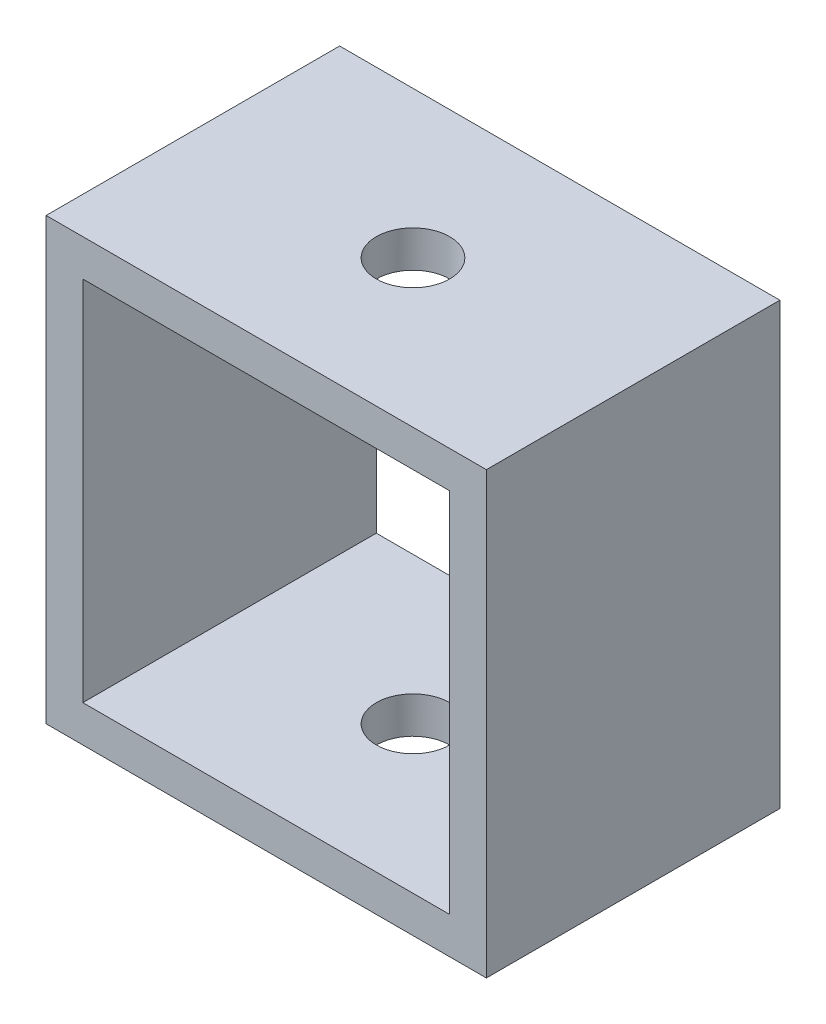
ISO-10303-21;
HEADER;
FILE_DESCRIPTION(('STEP AP214'),'2;1');
FILE_NAME('part.step','',(''),(''),'','','');
FILE_SCHEMA(('AUTOMOTIVE_DESIGN { 1 0 10303 214 1 1 1 1 }'));
ENDSEC;
DATA;
#1=APPLICATION_CONTEXT('core data for automotive mechanical design processes');
#2=APPLICATION_PROTOCOL_DEFINITION('international standard','automotive_design',2000,#1);
#3=PRODUCT_CONTEXT('',#1,'mechanical');
#4=PRODUCT('Part','Part','',(#3));
#5=PRODUCT_RELATED_PRODUCT_CATEGORY('part','',(#4));
#6=PRODUCT_DEFINITION_FORMATION('','',#4);
#7=PRODUCT_DEFINITION_CONTEXT('part definition',#1,'design');
#8=PRODUCT_DEFINITION('design','',#6,#7);
#9=PRODUCT_DEFINITION_SHAPE('','',#8);
#10=(LENGTH_UNIT() NAMED_UNIT(*) SI_UNIT(.MILLI.,.METRE.));
#11=(NAMED_UNIT(*) PLANE_ANGLE_UNIT() SI_UNIT($,.RADIAN.));
#12=(NAMED_UNIT(*) SI_UNIT($,.STERADIAN.) SOLID_ANGLE_UNIT());
#13=UNCERTAINTY_MEASURE_WITH_UNIT(LENGTH_MEASURE(1.E-05),#10,'distance_accuracy_value','');
#14=(GEOMETRIC_REPRESENTATION_CONTEXT(3) GLOBAL_UNCERTAINTY_ASSIGNED_CONTEXT((#13)) GLOBAL_UNIT_ASSIGNED_CONTEXT((#10,
#11,#12)) REPRESENTATION_CONTEXT('',''));
#15=CARTESIAN_POINT('',(0.,0.,0.));
#16=DIRECTION('',(0.,0.,1.));
#17=DIRECTION('',(1.,0.,0.));
#18=AXIS2_PLACEMENT_3D('',#15,#16,#17);
#19=CARTESIAN_POINT('',(-19.05,38.1,-12.7));
#20=DIRECTION('',(0.,0.,1.));
#21=DIRECTION('',(1.,0.,0.));
#22=AXIS2_PLACEMENT_3D('',#19,#20,#21);
#23=PLANE('',#22);
#24=DIRECTION('',(-1.,0.,0.));
#25=VECTOR('',#24,1.);
#26=CARTESIAN_POINT('',(-19.05,0.,-12.7));
#27=LINE('',#26,#25);
#28=CARTESIAN_POINT('',(19.05,0.,-12.7));
#29=VERTEX_POINT('',#28);
#30=CARTESIAN_POINT('',(-19.05,0.,-12.7));
#31=VERTEX_POINT('',#30);
#32=EDGE_CURVE('E113',#29,#31,#27,.T.);
#33=ORIENTED_EDGE('',*,*,#32,.T.);
#34=DIRECTION('',(0.,-1.,0.));
#35=VECTOR('',#34,1.);
#36=CARTESIAN_POINT('',(-19.05,38.1,-12.7));
#37=LINE('',#36,#35);
#38=CARTESIAN_POINT('',(-19.05,38.1,-12.7));
#39=VERTEX_POINT('',#38);
#40=EDGE_CURVE('E127',#39,#31,#37,.T.);
#41=ORIENTED_EDGE('',*,*,#40,.F.);
#42=DIRECTION('',(-1.,0.,0.));
#43=VECTOR('',#42,1.);
#44=CARTESIAN_POINT('',(-19.05,38.1,-12.7));
#45=LINE('',#44,#43);
#46=CARTESIAN_POINT('',(19.05,38.1,-12.7));
#47=VERTEX_POINT('',#46);
#48=EDGE_CURVE('E164',#47,#39,#45,.T.);
#49=ORIENTED_EDGE('',*,*,#48,.F.);
#50=DIRECTION('',(0.,-1.,0.));
#51=VECTOR('',#50,1.);
#52=CARTESIAN_POINT('',(19.05,38.1,-12.7));
#53=LINE('',#52,#51);
#54=EDGE_CURVE('E40',#47,#29,#53,.T.);
#55=ORIENTED_EDGE('',*,*,#54,.T.);
#56=EDGE_LOOP('',(#33,#41,#49,#55));
#57=FACE_BOUND('',#56,.T.);
#58=DIRECTION('',(-1.,0.,0.));
#59=VECTOR('',#58,1.);
#60=CARTESIAN_POINT('',(0.,3.175,-12.7));
#61=LINE('',#60,#59);
#62=CARTESIAN_POINT('',(15.875,3.175,-12.7));
#63=VERTEX_POINT('',#62);
#64=CARTESIAN_POINT('',(-15.875,3.175,-12.7));
#65=VERTEX_POINT('',#64);
#66=EDGE_CURVE('E149',#63,#65,#61,.T.);
#67=ORIENTED_EDGE('',*,*,#66,.F.);
#68=DIRECTION('',(0.,-1.,0.));
#69=VECTOR('',#68,1.);
#70=CARTESIAN_POINT('',(15.875,38.1,-12.7));
#71=LINE('',#70,#69);
#72=CARTESIAN_POINT('',(15.875,34.925,-12.7));
#73=VERTEX_POINT('',#72);
#74=EDGE_CURVE('E115',#73,#63,#71,.T.);
#75=ORIENTED_EDGE('',*,*,#74,.F.);
#76=DIRECTION('',(-1.,0.,0.));
#77=VECTOR('',#76,1.);
#78=CARTESIAN_POINT('',(0.,34.925,-12.7));
#79=LINE('',#78,#77);
#80=CARTESIAN_POINT('',(-15.875,34.925,-12.7));
#81=VERTEX_POINT('',#80);
#82=EDGE_CURVE('E152',#73,#81,#79,.T.);
#83=ORIENTED_EDGE('',*,*,#82,.T.);
#84=DIRECTION('',(0.,-1.,0.));
#85=VECTOR('',#84,1.);
#86=CARTESIAN_POINT('',(-15.875,38.1,-12.7));
#87=LINE('',#86,#85);
#88=EDGE_CURVE('E120',#81,#65,#87,.T.);
#89=ORIENTED_EDGE('',*,*,#88,.T.);
#90=EDGE_LOOP('',(#67,#75,#83,#89));
#91=FACE_BOUND('',#90,.T.);
#92=ADVANCED_FACE('F32',(#57,#91),#23,.F.);
#93=CARTESIAN_POINT('',(19.05,38.1,-12.7));
#94=DIRECTION('',(-1.,0.,0.));
#95=DIRECTION('',(0.,0.,1.));
#96=AXIS2_PLACEMENT_3D('',#93,#94,#95);
#97=PLANE('',#96);
#98=DIRECTION('',(0.,0.,-1.));
#99=VECTOR('',#98,1.);
#100=CARTESIAN_POINT('',(19.05,38.1,-12.7));
#101=LINE('',#100,#99);
#102=CARTESIAN_POINT('',(19.05,38.1,12.7));
#103=VERTEX_POINT('',#102);
#104=EDGE_CURVE('E109',#103,#47,#101,.T.);
#105=ORIENTED_EDGE('',*,*,#104,.F.);
#106=DIRECTION('',(0.,1.,0.));
#107=VECTOR('',#106,1.);
#108=CARTESIAN_POINT('',(19.05,0.,12.7));
#109=LINE('',#108,#107);
#110=CARTESIAN_POINT('',(19.05,0.,12.7));
#111=VERTEX_POINT('',#110);
#112=EDGE_CURVE('E96',#111,#103,#109,.T.);
#113=ORIENTED_EDGE('',*,*,#112,.F.);
#114=DIRECTION('',(0.,0.,-1.));
#115=VECTOR('',#114,1.);
#116=CARTESIAN_POINT('',(19.05,0.,-12.7));
#117=LINE('',#116,#115);
#118=EDGE_CURVE('E107',#111,#29,#117,.T.);
#119=ORIENTED_EDGE('',*,*,#118,.T.);
#120=ORIENTED_EDGE('',*,*,#54,.F.);
#121=EDGE_LOOP('',(#105,#113,#119,#120));
#122=FACE_BOUND('',#121,.T.);
#123=ADVANCED_FACE('F34',(#122),#97,.F.);
#124=CARTESIAN_POINT('',(-19.05,38.1,12.7));
#125=DIRECTION('',(1.,0.,0.));
#126=DIRECTION('',(0.,0.,-1.));
#127=AXIS2_PLACEMENT_3D('',#124,#125,#126);
#128=PLANE('',#127);
#129=DIRECTION('',(0.,0.,1.));
#130=VECTOR('',#129,1.);
#131=CARTESIAN_POINT('',(-19.05,0.,12.7));
#132=LINE('',#131,#130);
#133=CARTESIAN_POINT('',(-19.05,0.,12.7));
#134=VERTEX_POINT('',#133);
#135=EDGE_CURVE('E117',#31,#134,#132,.T.);
#136=ORIENTED_EDGE('',*,*,#135,.T.);
#137=DIRECTION('',(0.,1.,0.));
#138=VECTOR('',#137,1.);
#139=CARTESIAN_POINT('',(-19.05,0.,12.7));
#140=LINE('',#139,#138);
#141=CARTESIAN_POINT('',(-19.05,38.1,12.7));
#142=VERTEX_POINT('',#141);
#143=EDGE_CURVE('E47',#134,#142,#140,.T.);
#144=ORIENTED_EDGE('',*,*,#143,.T.);
#145=DIRECTION('',(0.,0.,1.));
#146=VECTOR('',#145,1.);
#147=CARTESIAN_POINT('',(-19.05,38.1,12.7));
#148=LINE('',#147,#146);
#149=EDGE_CURVE('E123',#39,#142,#148,.T.);
#150=ORIENTED_EDGE('',*,*,#149,.F.);
#151=ORIENTED_EDGE('',*,*,#40,.T.);
#152=EDGE_LOOP('',(#136,#144,#150,#151));
#153=FACE_BOUND('',#152,.T.);
#154=ADVANCED_FACE('F172',(#153),#128,.F.);
#155=CARTESIAN_POINT('',(0.,38.1,0.));
#156=DIRECTION('',(0.,-1.,0.));
#157=DIRECTION('',(0.,0.,-1.));
#158=AXIS2_PLACEMENT_3D('',#155,#156,#157);
#159=PLANE('',#158);
#160=CARTESIAN_POINT('',(0.,38.1,0.));
#161=DIRECTION('',(0.,1.,0.));
#162=DIRECTION('',(0.,0.,1.));
#163=AXIS2_PLACEMENT_3D('',#160,#161,#162);
#164=CIRCLE('',#163,3.17500000000001);
#165=CARTESIAN_POINT('',(0.,38.1,3.17500000000001));
#166=VERTEX_POINT('',#165);
#167=EDGE_CURVE('E140',#166,#166,#164,.T.);
#168=ORIENTED_EDGE('',*,*,#167,.F.);
#169=EDGE_LOOP('',(#168));
#170=FACE_BOUND('',#169,.T.);
#171=ORIENTED_EDGE('',*,*,#149,.T.);
#172=DIRECTION('',(-1.,0.,0.));
#173=VECTOR('',#172,1.);
#174=CARTESIAN_POINT('',(19.05,38.1,12.7));
#175=LINE('',#174,#173);
#176=EDGE_CURVE('E102',#103,#142,#175,.T.);
#177=ORIENTED_EDGE('',*,*,#176,.F.);
#178=ORIENTED_EDGE('',*,*,#104,.T.);
#179=ORIENTED_EDGE('',*,*,#48,.T.);
#180=EDGE_LOOP('',(#171,#177,#178,#179));
#181=FACE_BOUND('',#180,.T.);
#182=ADVANCED_FACE('F170',(#170,#181),#159,.F.);
#183=CARTESIAN_POINT('',(0.,0.,0.));
#184=DIRECTION('',(0.,-1.,0.));
#185=DIRECTION('',(0.,0.,-1.));
#186=AXIS2_PLACEMENT_3D('',#183,#184,#185);
#187=PLANE('',#186);
#188=DIRECTION('',(-1.,0.,0.));
#189=VECTOR('',#188,1.);
#190=CARTESIAN_POINT('',(19.05,0.,12.7));
#191=LINE('',#190,#189);
#192=EDGE_CURVE('E93',#111,#134,#191,.T.);
#193=ORIENTED_EDGE('',*,*,#192,.T.);
#194=ORIENTED_EDGE('',*,*,#135,.F.);
#195=ORIENTED_EDGE('',*,*,#32,.F.);
#196=ORIENTED_EDGE('',*,*,#118,.F.);
#197=EDGE_LOOP('',(#193,#194,#195,#196));
#198=FACE_BOUND('',#197,.T.);
#199=CARTESIAN_POINT('',(0.,0.,0.));
#200=DIRECTION('',(0.,1.,0.));
#201=DIRECTION('',(0.,0.,1.));
#202=AXIS2_PLACEMENT_3D('',#199,#200,#201);
#203=CIRCLE('',#202,3.17500000000001);
#204=CARTESIAN_POINT('',(0.,0.,3.17500000000001));
#205=VERTEX_POINT('',#204);
#206=EDGE_CURVE('E133',#205,#205,#203,.T.);
#207=ORIENTED_EDGE('',*,*,#206,.T.);
#208=EDGE_LOOP('',(#207));
#209=FACE_BOUND('',#208,.T.);
#210=ADVANCED_FACE('F111',(#198,#209),#187,.T.);
#211=CARTESIAN_POINT('',(15.875,38.1,-12.7));
#212=DIRECTION('',(-1.,0.,0.));
#213=DIRECTION('',(0.,0.,1.));
#214=AXIS2_PLACEMENT_3D('',#211,#212,#213);
#215=PLANE('',#214);
#216=DIRECTION('',(0.,-1.,0.));
#217=VECTOR('',#216,1.);
#218=CARTESIAN_POINT('',(15.875,38.1,12.7));
#219=LINE('',#218,#217);
#220=CARTESIAN_POINT('',(15.875,34.925,12.7));
#221=VERTEX_POINT('',#220);
#222=CARTESIAN_POINT('',(15.875,3.175,12.7));
#223=VERTEX_POINT('',#222);
#224=EDGE_CURVE('E55',#221,#223,#219,.T.);
#225=ORIENTED_EDGE('',*,*,#224,.F.);
#226=DIRECTION('',(0.,0.,-1.));
#227=VECTOR('',#226,1.);
#228=CARTESIAN_POINT('',(15.875,34.925,0.));
#229=LINE('',#228,#227);
#230=EDGE_CURVE('E150',#221,#73,#229,.T.);
#231=ORIENTED_EDGE('',*,*,#230,.T.);
#232=ORIENTED_EDGE('',*,*,#74,.T.);
#233=DIRECTION('',(0.,0.,-1.));
#234=VECTOR('',#233,1.);
#235=CARTESIAN_POINT('',(15.875,3.175,0.));
#236=LINE('',#235,#234);
#237=EDGE_CURVE('E137',#223,#63,#236,.T.);
#238=ORIENTED_EDGE('',*,*,#237,.F.);
#239=EDGE_LOOP('',(#225,#231,#232,#238));
#240=FACE_BOUND('',#239,.T.);
#241=ADVANCED_FACE('F185',(#240),#215,.T.);
#242=CARTESIAN_POINT('',(-15.875,38.1,12.7));
#243=DIRECTION('',(1.,0.,0.));
#244=DIRECTION('',(0.,0.,-1.));
#245=AXIS2_PLACEMENT_3D('',#242,#243,#244);
#246=PLANE('',#245);
#247=DIRECTION('',(0.,1.,0.));
#248=VECTOR('',#247,1.);
#249=CARTESIAN_POINT('',(-15.875,38.1,12.7));
#250=LINE('',#249,#248);
#251=CARTESIAN_POINT('',(-15.875,3.175,12.7));
#252=VERTEX_POINT('',#251);
#253=CARTESIAN_POINT('',(-15.875,34.925,12.7));
#254=VERTEX_POINT('',#253);
#255=EDGE_CURVE('E173',#252,#254,#250,.T.);
#256=ORIENTED_EDGE('',*,*,#255,.F.);
#257=DIRECTION('',(0.,0.,1.));
#258=VECTOR('',#257,1.);
#259=CARTESIAN_POINT('',(-15.875,3.175,0.));
#260=LINE('',#259,#258);
#261=EDGE_CURVE('E153',#65,#252,#260,.T.);
#262=ORIENTED_EDGE('',*,*,#261,.F.);
#263=ORIENTED_EDGE('',*,*,#88,.F.);
#264=DIRECTION('',(0.,0.,1.));
#265=VECTOR('',#264,1.);
#266=CARTESIAN_POINT('',(-15.875,34.925,0.));
#267=LINE('',#266,#265);
#268=EDGE_CURVE('E154',#81,#254,#267,.T.);
#269=ORIENTED_EDGE('',*,*,#268,.T.);
#270=EDGE_LOOP('',(#256,#262,#263,#269));
#271=FACE_BOUND('',#270,.T.);
#272=ADVANCED_FACE('F196',(#271),#246,.T.);
#273=CARTESIAN_POINT('',(0.,34.925,0.));
#274=DIRECTION('',(0.,-1.,0.));
#275=DIRECTION('',(0.,0.,-1.));
#276=AXIS2_PLACEMENT_3D('',#273,#274,#275);
#277=PLANE('',#276);
#278=DIRECTION('',(1.,0.,0.));
#279=VECTOR('',#278,1.);
#280=CARTESIAN_POINT('',(0.,34.925,12.7));
#281=LINE('',#280,#279);
#282=EDGE_CURVE('E144',#254,#221,#281,.T.);
#283=ORIENTED_EDGE('',*,*,#282,.F.);
#284=ORIENTED_EDGE('',*,*,#268,.F.);
#285=ORIENTED_EDGE('',*,*,#82,.F.);
#286=ORIENTED_EDGE('',*,*,#230,.F.);
#287=EDGE_LOOP('',(#283,#284,#285,#286));
#288=FACE_BOUND('',#287,.T.);
#289=CARTESIAN_POINT('',(0.,34.925,0.));
#290=DIRECTION('',(0.,-1.,0.));
#291=DIRECTION('',(0.,0.,-1.));
#292=AXIS2_PLACEMENT_3D('',#289,#290,#291);
#293=CIRCLE('',#292,3.17500000000001);
#294=CARTESIAN_POINT('',(0.,34.925,-3.17500000000001));
#295=VERTEX_POINT('',#294);
#296=EDGE_CURVE('E132',#295,#295,#293,.T.);
#297=ORIENTED_EDGE('',*,*,#296,.F.);
#298=EDGE_LOOP('',(#297));
#299=FACE_BOUND('',#298,.T.);
#300=ADVANCED_FACE('F187',(#288,#299),#277,.T.);
#301=CARTESIAN_POINT('',(0.,3.175,0.));
#302=DIRECTION('',(0.,-1.,0.));
#303=DIRECTION('',(0.,0.,-1.));
#304=AXIS2_PLACEMENT_3D('',#301,#302,#303);
#305=PLANE('',#304);
#306=CARTESIAN_POINT('',(0.,3.175,0.));
#307=DIRECTION('',(0.,-1.,0.));
#308=DIRECTION('',(0.,0.,-1.));
#309=AXIS2_PLACEMENT_3D('',#306,#307,#308);
#310=CIRCLE('',#309,3.17500000000001);
#311=CARTESIAN_POINT('',(0.,3.175,-3.17500000000001));
#312=VERTEX_POINT('',#311);
#313=EDGE_CURVE('E130',#312,#312,#310,.T.);
#314=ORIENTED_EDGE('',*,*,#313,.T.);
#315=EDGE_LOOP('',(#314));
#316=FACE_BOUND('',#315,.T.);
#317=ORIENTED_EDGE('',*,*,#261,.T.);
#318=DIRECTION('',(1.,0.,0.));
#319=VECTOR('',#318,1.);
#320=CARTESIAN_POINT('',(0.,3.175,12.7));
#321=LINE('',#320,#319);
#322=EDGE_CURVE('E11',#252,#223,#321,.T.);
#323=ORIENTED_EDGE('',*,*,#322,.T.);
#324=ORIENTED_EDGE('',*,*,#237,.T.);
#325=ORIENTED_EDGE('',*,*,#66,.T.);
#326=EDGE_LOOP('',(#317,#323,#324,#325));
#327=FACE_BOUND('',#326,.T.);
#328=ADVANCED_FACE('F194',(#316,#327),#305,.F.);
#329=CARTESIAN_POINT('',(0.,38.1,0.));
#330=DIRECTION('',(0.,1.,0.));
#331=DIRECTION('',(0.,0.,1.));
#332=AXIS2_PLACEMENT_3D('',#329,#330,#331);
#333=CYLINDRICAL_SURFACE('',#332,3.17500000000001);
#334=ORIENTED_EDGE('',*,*,#206,.F.);
#335=EDGE_LOOP('',(#334));
#336=FACE_BOUND('',#335,.T.);
#337=ORIENTED_EDGE('',*,*,#313,.F.);
#338=EDGE_LOOP('',(#337));
#339=FACE_BOUND('',#338,.T.);
#340=ADVANCED_FACE('F219',(#336,#339),#333,.F.);
#341=ORIENTED_EDGE('',*,*,#296,.T.);
#342=EDGE_LOOP('',(#341));
#343=FACE_BOUND('',#342,.T.);
#344=ORIENTED_EDGE('',*,*,#167,.T.);
#345=EDGE_LOOP('',(#344));
#346=FACE_BOUND('',#345,.T.);
#347=ADVANCED_FACE('F223',(#343,#346),#333,.F.);
#348=CARTESIAN_POINT('',(19.05,0.,12.7));
#349=DIRECTION('',(0.,0.,-1.));
#350=DIRECTION('',(-1.,0.,0.));
#351=AXIS2_PLACEMENT_3D('',#348,#349,#350);
#352=PLANE('',#351);
#353=ORIENTED_EDGE('',*,*,#282,.T.);
#354=ORIENTED_EDGE('',*,*,#224,.T.);
#355=ORIENTED_EDGE('',*,*,#322,.F.);
#356=ORIENTED_EDGE('',*,*,#255,.T.);
#357=EDGE_LOOP('',(#353,#354,#355,#356));
#358=FACE_BOUND('',#357,.T.);
#359=ORIENTED_EDGE('',*,*,#176,.T.);
#360=ORIENTED_EDGE('',*,*,#143,.F.);
#361=ORIENTED_EDGE('',*,*,#192,.F.);
#362=ORIENTED_EDGE('',*,*,#112,.T.);
#363=EDGE_LOOP('',(#359,#360,#361,#362));
#364=FACE_BOUND('',#363,.T.);
#365=ADVANCED_FACE('F95',(#358,#364),#352,.F.);
#366=CLOSED_SHELL('',(#92,#123,#154,#182,#210,#241,#272,#300,#328,#340,#347,#365));
#367=MANIFOLD_SOLID_BREP('B2',#366);
#368=ADVANCED_BREP_SHAPE_REPRESENTATION('',(#18,#367),#14);
#369=SHAPE_DEFINITION_REPRESENTATION(#9,#368);
ENDSEC;
END-ISO-10303-21;
